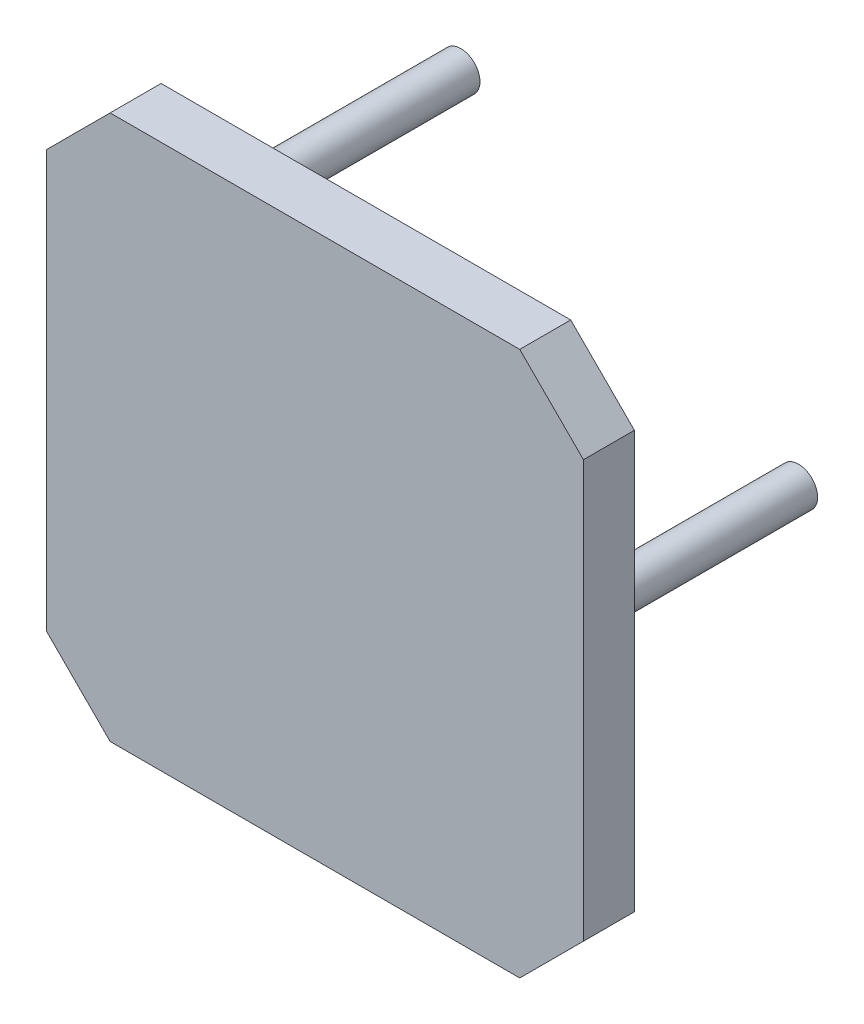
ISO-10303-21;
HEADER;
FILE_DESCRIPTION(('STEP AP214'),'2;1');
FILE_NAME('part.step','',(''),(''),'','','');
FILE_SCHEMA(('AUTOMOTIVE_DESIGN { 1 0 10303 214 1 1 1 1 }'));
ENDSEC;
DATA;
#1=APPLICATION_CONTEXT('core data for automotive mechanical design processes');
#2=APPLICATION_PROTOCOL_DEFINITION('international standard','automotive_design',2000,#1);
#3=PRODUCT_CONTEXT('',#1,'mechanical');
#4=PRODUCT('Part','Part','',(#3));
#5=PRODUCT_RELATED_PRODUCT_CATEGORY('part','',(#4));
#6=PRODUCT_DEFINITION_FORMATION('','',#4);
#7=PRODUCT_DEFINITION_CONTEXT('part definition',#1,'design');
#8=PRODUCT_DEFINITION('design','',#6,#7);
#9=PRODUCT_DEFINITION_SHAPE('','',#8);
#10=(LENGTH_UNIT() NAMED_UNIT(*) SI_UNIT(.MILLI.,.METRE.));
#11=(NAMED_UNIT(*) PLANE_ANGLE_UNIT() SI_UNIT($,.RADIAN.));
#12=(NAMED_UNIT(*) SI_UNIT($,.STERADIAN.) SOLID_ANGLE_UNIT());
#13=UNCERTAINTY_MEASURE_WITH_UNIT(LENGTH_MEASURE(1.E-05),#10,'distance_accuracy_value','');
#14=(GEOMETRIC_REPRESENTATION_CONTEXT(3) GLOBAL_UNCERTAINTY_ASSIGNED_CONTEXT((#13)) GLOBAL_UNIT_ASSIGNED_CONTEXT((#10,
#11,#12)) REPRESENTATION_CONTEXT('',''));
#15=CARTESIAN_POINT('',(0.,0.,0.));
#16=DIRECTION('',(0.,0.,1.));
#17=DIRECTION('',(1.,0.,0.));
#18=AXIS2_PLACEMENT_3D('',#15,#16,#17);
#19=CARTESIAN_POINT('',(-16.0306704898778,-21.3657958464577,4.));
#20=DIRECTION('',(0.,1.,0.));
#21=DIRECTION('',(0.,0.,1.));
#22=AXIS2_PLACEMENT_3D('',#19,#20,#21);
#23=PLANE('',#22);
#24=DIRECTION('',(1.,0.,0.));
#25=VECTOR('',#24,1.);
#26=CARTESIAN_POINT('',(-16.0306704898778,-21.3657958464577,4.));
#27=LINE('',#26,#25);
#28=CARTESIAN_POINT('',(-11.0306704898778,-21.3657958464577,4.));
#29=VERTEX_POINT('',#28);
#30=CARTESIAN_POINT('',(21.1208261403336,-21.3657958464577,4.));
#31=VERTEX_POINT('',#30);
#32=EDGE_CURVE('E124',#29,#31,#27,.T.);
#33=ORIENTED_EDGE('',*,*,#32,.F.);
#34=DIRECTION('',(0.,0.,-1.));
#35=VECTOR('',#34,1.);
#36=CARTESIAN_POINT('',(-11.0306704898778,-21.3657958464577,4.));
#37=LINE('',#36,#35);
#38=CARTESIAN_POINT('',(-11.0306704898778,-21.3657958464577,0.));
#39=VERTEX_POINT('',#38);
#40=EDGE_CURVE('E109',#29,#39,#37,.T.);
#41=ORIENTED_EDGE('',*,*,#40,.T.);
#42=DIRECTION('',(1.,0.,0.));
#43=VECTOR('',#42,1.);
#44=CARTESIAN_POINT('',(-16.0306704898778,-21.3657958464577,0.));
#45=LINE('',#44,#43);
#46=CARTESIAN_POINT('',(21.1208261403336,-21.3657958464577,0.));
#47=VERTEX_POINT('',#46);
#48=EDGE_CURVE('E121',#39,#47,#45,.T.);
#49=ORIENTED_EDGE('',*,*,#48,.T.);
#50=DIRECTION('',(0.,0.,1.));
#51=VECTOR('',#50,1.);
#52=CARTESIAN_POINT('',(21.1208261403336,-21.3657958464577,4.));
#53=LINE('',#52,#51);
#54=EDGE_CURVE('E126',#47,#31,#53,.T.);
#55=ORIENTED_EDGE('',*,*,#54,.T.);
#56=EDGE_LOOP('',(#33,#41,#49,#55));
#57=FACE_BOUND('',#56,.T.);
#58=ADVANCED_FACE('F37',(#57),#23,.F.);
#59=CARTESIAN_POINT('',(26.1208261403336,21.3657958464577,4.));
#60=DIRECTION('',(-1.,0.,0.));
#61=DIRECTION('',(0.,0.,1.));
#62=AXIS2_PLACEMENT_3D('',#59,#60,#61);
#63=PLANE('',#62);
#64=DIRECTION('',(0.,1.,0.));
#65=VECTOR('',#64,1.);
#66=CARTESIAN_POINT('',(26.1208261403336,21.3657958464577,4.));
#67=LINE('',#66,#65);
#68=CARTESIAN_POINT('',(26.1208261403336,-16.3657958464577,4.));
#69=VERTEX_POINT('',#68);
#70=CARTESIAN_POINT('',(26.1208261403336,16.3657958464577,4.));
#71=VERTEX_POINT('',#70);
#72=EDGE_CURVE('E168',#69,#71,#67,.T.);
#73=ORIENTED_EDGE('',*,*,#72,.F.);
#74=DIRECTION('',(0.,0.,-1.));
#75=VECTOR('',#74,1.);
#76=CARTESIAN_POINT('',(26.1208261403336,-16.3657958464577,4.));
#77=LINE('',#76,#75);
#78=CARTESIAN_POINT('',(26.1208261403336,-16.3657958464577,0.));
#79=VERTEX_POINT('',#78);
#80=EDGE_CURVE('E11',#69,#79,#77,.T.);
#81=ORIENTED_EDGE('',*,*,#80,.T.);
#82=DIRECTION('',(0.,1.,0.));
#83=VECTOR('',#82,1.);
#84=CARTESIAN_POINT('',(26.1208261403336,21.3657958464577,0.));
#85=LINE('',#84,#83);
#86=CARTESIAN_POINT('',(26.1208261403336,16.3657958464577,0.));
#87=VERTEX_POINT('',#86);
#88=EDGE_CURVE('E131',#79,#87,#85,.T.);
#89=ORIENTED_EDGE('',*,*,#88,.T.);
#90=DIRECTION('',(0.,0.,1.));
#91=VECTOR('',#90,1.);
#92=CARTESIAN_POINT('',(26.1208261403336,16.3657958464577,4.));
#93=LINE('',#92,#91);
#94=EDGE_CURVE('E46',#87,#71,#93,.T.);
#95=ORIENTED_EDGE('',*,*,#94,.T.);
#96=EDGE_LOOP('',(#73,#81,#89,#95));
#97=FACE_BOUND('',#96,.T.);
#98=ADVANCED_FACE('F167',(#97),#63,.F.);
#99=CARTESIAN_POINT('',(-16.0306704898778,21.3657958464577,4.));
#100=DIRECTION('',(0.,-1.,0.));
#101=DIRECTION('',(0.,0.,-1.));
#102=AXIS2_PLACEMENT_3D('',#99,#100,#101);
#103=PLANE('',#102);
#104=DIRECTION('',(-1.,0.,0.));
#105=VECTOR('',#104,1.);
#106=CARTESIAN_POINT('',(-16.0306704898778,21.3657958464577,0.));
#107=LINE('',#106,#105);
#108=CARTESIAN_POINT('',(21.1208261403336,21.3657958464577,0.));
#109=VERTEX_POINT('',#108);
#110=CARTESIAN_POINT('',(-11.0306704898778,21.3657958464577,0.));
#111=VERTEX_POINT('',#110);
#112=EDGE_CURVE('E135',#109,#111,#107,.T.);
#113=ORIENTED_EDGE('',*,*,#112,.T.);
#114=DIRECTION('',(0.,0.,1.));
#115=VECTOR('',#114,1.);
#116=CARTESIAN_POINT('',(-11.0306704898778,21.3657958464577,4.));
#117=LINE('',#116,#115);
#118=CARTESIAN_POINT('',(-11.0306704898778,21.3657958464577,4.));
#119=VERTEX_POINT('',#118);
#120=EDGE_CURVE('E53',#111,#119,#117,.T.);
#121=ORIENTED_EDGE('',*,*,#120,.T.);
#122=DIRECTION('',(-1.,0.,0.));
#123=VECTOR('',#122,1.);
#124=CARTESIAN_POINT('',(-16.0306704898778,21.3657958464577,4.));
#125=LINE('',#124,#123);
#126=CARTESIAN_POINT('',(21.1208261403336,21.3657958464577,4.));
#127=VERTEX_POINT('',#126);
#128=EDGE_CURVE('E174',#127,#119,#125,.T.);
#129=ORIENTED_EDGE('',*,*,#128,.F.);
#130=DIRECTION('',(0.,0.,-1.));
#131=VECTOR('',#130,1.);
#132=CARTESIAN_POINT('',(21.1208261403336,21.3657958464577,4.));
#133=LINE('',#132,#131);
#134=EDGE_CURVE('E161',#127,#109,#133,.T.);
#135=ORIENTED_EDGE('',*,*,#134,.T.);
#136=EDGE_LOOP('',(#113,#121,#129,#135));
#137=FACE_BOUND('',#136,.T.);
#138=ADVANCED_FACE('F178',(#137),#103,.F.);
#139=CARTESIAN_POINT('',(-16.0306704898778,-21.3657958464577,4.));
#140=DIRECTION('',(1.,0.,0.));
#141=DIRECTION('',(0.,0.,-1.));
#142=AXIS2_PLACEMENT_3D('',#139,#140,#141);
#143=PLANE('',#142);
#144=DIRECTION('',(0.,-1.,0.));
#145=VECTOR('',#144,1.);
#146=CARTESIAN_POINT('',(-16.0306704898778,-21.3657958464577,0.));
#147=LINE('',#146,#145);
#148=CARTESIAN_POINT('',(-16.0306704898778,16.3657958464577,0.));
#149=VERTEX_POINT('',#148);
#150=CARTESIAN_POINT('',(-16.0306704898778,-16.3657958464577,0.));
#151=VERTEX_POINT('',#150);
#152=EDGE_CURVE('E145',#149,#151,#147,.T.);
#153=ORIENTED_EDGE('',*,*,#152,.T.);
#154=DIRECTION('',(0.,0.,1.));
#155=VECTOR('',#154,1.);
#156=CARTESIAN_POINT('',(-16.0306704898778,-16.3657958464577,4.));
#157=LINE('',#156,#155);
#158=CARTESIAN_POINT('',(-16.0306704898778,-16.3657958464577,4.));
#159=VERTEX_POINT('',#158);
#160=EDGE_CURVE('E110',#151,#159,#157,.T.);
#161=ORIENTED_EDGE('',*,*,#160,.T.);
#162=DIRECTION('',(0.,-1.,0.));
#163=VECTOR('',#162,1.);
#164=CARTESIAN_POINT('',(-16.0306704898778,-21.3657958464577,4.));
#165=LINE('',#164,#163);
#166=CARTESIAN_POINT('',(-16.0306704898778,16.3657958464577,4.));
#167=VERTEX_POINT('',#166);
#168=EDGE_CURVE('E141',#167,#159,#165,.T.);
#169=ORIENTED_EDGE('',*,*,#168,.F.);
#170=DIRECTION('',(0.,0.,-1.));
#171=VECTOR('',#170,1.);
#172=CARTESIAN_POINT('',(-16.0306704898778,16.3657958464577,4.));
#173=LINE('',#172,#171);
#174=EDGE_CURVE('E115',#167,#149,#173,.T.);
#175=ORIENTED_EDGE('',*,*,#174,.T.);
#176=EDGE_LOOP('',(#153,#161,#169,#175));
#177=FACE_BOUND('',#176,.T.);
#178=ADVANCED_FACE('F185',(#177),#143,.F.);
#179=CARTESIAN_POINT('',(0.,0.,4.));
#180=DIRECTION('',(0.,0.,-1.));
#181=DIRECTION('',(-1.,0.,0.));
#182=AXIS2_PLACEMENT_3D('',#179,#180,#181);
#183=PLANE('',#182);
#184=ORIENTED_EDGE('',*,*,#168,.T.);
#185=DIRECTION('',(-0.707106781186547,0.707106781186549,0.));
#186=VECTOR('',#185,1.);
#187=CARTESIAN_POINT('',(-11.0306704898778,-21.3657958464577,4.));
#188=LINE('',#187,#186);
#189=EDGE_CURVE('E159',#159,#29,#188,.F.);
#190=ORIENTED_EDGE('',*,*,#189,.T.);
#191=ORIENTED_EDGE('',*,*,#32,.T.);
#192=DIRECTION('',(-0.707106781186549,-0.707106781186547,0.));
#193=VECTOR('',#192,1.);
#194=CARTESIAN_POINT('',(26.1208261403336,-16.3657958464577,4.));
#195=LINE('',#194,#193);
#196=EDGE_CURVE('E155',#31,#69,#195,.F.);
#197=ORIENTED_EDGE('',*,*,#196,.T.);
#198=ORIENTED_EDGE('',*,*,#72,.T.);
#199=DIRECTION('',(0.707106781186547,-0.707106781186549,0.));
#200=VECTOR('',#199,1.);
#201=CARTESIAN_POINT('',(21.1208261403336,21.3657958464577,4.));
#202=LINE('',#201,#200);
#203=EDGE_CURVE('E60',#71,#127,#202,.F.);
#204=ORIENTED_EDGE('',*,*,#203,.T.);
#205=ORIENTED_EDGE('',*,*,#128,.T.);
#206=DIRECTION('',(0.707106781186549,0.707106781186547,0.));
#207=VECTOR('',#206,1.);
#208=CARTESIAN_POINT('',(-16.0306704898778,16.3657958464577,4.));
#209=LINE('',#208,#207);
#210=EDGE_CURVE('E157',#119,#167,#209,.F.);
#211=ORIENTED_EDGE('',*,*,#210,.T.);
#212=EDGE_LOOP('',(#184,#190,#191,#197,#198,#204,#205,#211));
#213=FACE_BOUND('',#212,.T.);
#214=ADVANCED_FACE('F172',(#213),#183,.F.);
#215=CARTESIAN_POINT('',(0.,0.,0.));
#216=DIRECTION('',(0.,0.,-1.));
#217=DIRECTION('',(-1.,0.,0.));
#218=AXIS2_PLACEMENT_3D('',#215,#216,#217);
#219=PLANE('',#218);
#220=CARTESIAN_POINT('',(-6.5,-15.,0.));
#221=DIRECTION('',(0.,0.,-1.));
#222=DIRECTION('',(1.,0.,0.));
#223=AXIS2_PLACEMENT_3D('',#220,#221,#222);
#224=CIRCLE('',#223,1.5);
#225=CARTESIAN_POINT('',(-5.,-15.,0.));
#226=VERTEX_POINT('',#225);
#227=EDGE_CURVE('E197',#226,#226,#224,.T.);
#228=ORIENTED_EDGE('',*,*,#227,.F.);
#229=EDGE_LOOP('',(#228));
#230=FACE_BOUND('',#229,.T.);
#231=CARTESIAN_POINT('',(-6.5,15.,0.));
#232=DIRECTION('',(0.,0.,-1.));
#233=DIRECTION('',(-1.,0.,0.));
#234=AXIS2_PLACEMENT_3D('',#231,#232,#233);
#235=CIRCLE('',#234,1.5);
#236=CARTESIAN_POINT('',(-8.,15.,0.));
#237=VERTEX_POINT('',#236);
#238=EDGE_CURVE('E191',#237,#237,#235,.T.);
#239=ORIENTED_EDGE('',*,*,#238,.F.);
#240=EDGE_LOOP('',(#239));
#241=FACE_BOUND('',#240,.T.);
#242=CARTESIAN_POINT('',(20.,0.,0.));
#243=DIRECTION('',(0.,0.,-1.));
#244=DIRECTION('',(-1.,0.,0.));
#245=AXIS2_PLACEMENT_3D('',#242,#243,#244);
#246=CIRCLE('',#245,1.5);
#247=CARTESIAN_POINT('',(18.5,0.,0.));
#248=VERTEX_POINT('',#247);
#249=EDGE_CURVE('E138',#248,#248,#246,.T.);
#250=ORIENTED_EDGE('',*,*,#249,.F.);
#251=EDGE_LOOP('',(#250));
#252=FACE_BOUND('',#251,.T.);
#253=ORIENTED_EDGE('',*,*,#48,.F.);
#254=DIRECTION('',(0.707106781186547,-0.707106781186549,0.));
#255=VECTOR('',#254,1.);
#256=CARTESIAN_POINT('',(-16.1982331681678,-16.1982331681677,0.));
#257=LINE('',#256,#255);
#258=EDGE_CURVE('E105',#39,#151,#257,.F.);
#259=ORIENTED_EDGE('',*,*,#258,.T.);
#260=ORIENTED_EDGE('',*,*,#152,.F.);
#261=DIRECTION('',(-0.707106781186549,-0.707106781186547,0.));
#262=VECTOR('',#261,1.);
#263=CARTESIAN_POINT('',(-16.1982331681677,16.1982331681678,0.));
#264=LINE('',#263,#262);
#265=EDGE_CURVE('E116',#149,#111,#264,.F.);
#266=ORIENTED_EDGE('',*,*,#265,.T.);
#267=ORIENTED_EDGE('',*,*,#112,.F.);
#268=DIRECTION('',(-0.707106781186547,0.707106781186549,0.));
#269=VECTOR('',#268,1.);
#270=CARTESIAN_POINT('',(21.2433109933957,21.2433109933956,0.));
#271=LINE('',#270,#269);
#272=EDGE_CURVE('E125',#109,#87,#271,.F.);
#273=ORIENTED_EDGE('',*,*,#272,.T.);
#274=ORIENTED_EDGE('',*,*,#88,.F.);
#275=DIRECTION('',(0.707106781186549,0.707106781186547,0.));
#276=VECTOR('',#275,1.);
#277=CARTESIAN_POINT('',(21.2433109933956,-21.2433109933957,0.));
#278=LINE('',#277,#276);
#279=EDGE_CURVE('E130',#79,#47,#278,.F.);
#280=ORIENTED_EDGE('',*,*,#279,.T.);
#281=EDGE_LOOP('',(#253,#259,#260,#266,#267,#273,#274,#280));
#282=FACE_BOUND('',#281,.T.);
#283=ADVANCED_FACE('F128',(#230,#241,#252,#282),#219,.T.);
#284=CARTESIAN_POINT('',(-11.0306704898778,-21.3657958464577,4.));
#285=DIRECTION('',(0.707106781186548,0.707106781186546,0.));
#286=DIRECTION('',(0.,0.,-1.));
#287=AXIS2_PLACEMENT_3D('',#284,#285,#286);
#288=PLANE('',#287);
#289=ORIENTED_EDGE('',*,*,#189,.F.);
#290=ORIENTED_EDGE('',*,*,#160,.F.);
#291=ORIENTED_EDGE('',*,*,#258,.F.);
#292=ORIENTED_EDGE('',*,*,#40,.F.);
#293=EDGE_LOOP('',(#289,#290,#291,#292));
#294=FACE_BOUND('',#293,.T.);
#295=ADVANCED_FACE('F108',(#294),#288,.F.);
#296=CARTESIAN_POINT('',(-16.0306704898778,16.3657958464577,4.));
#297=DIRECTION('',(0.707106781186546,-0.707106781186548,0.));
#298=DIRECTION('',(0.,0.,-1.));
#299=AXIS2_PLACEMENT_3D('',#296,#297,#298);
#300=PLANE('',#299);
#301=ORIENTED_EDGE('',*,*,#210,.F.);
#302=ORIENTED_EDGE('',*,*,#120,.F.);
#303=ORIENTED_EDGE('',*,*,#265,.F.);
#304=ORIENTED_EDGE('',*,*,#174,.F.);
#305=EDGE_LOOP('',(#301,#302,#303,#304));
#306=FACE_BOUND('',#305,.T.);
#307=ADVANCED_FACE('F182',(#306),#300,.F.);
#308=CARTESIAN_POINT('',(26.1208261403336,-16.3657958464577,4.));
#309=DIRECTION('',(-0.707106781186546,0.707106781186548,0.));
#310=DIRECTION('',(0.,0.,-1.));
#311=AXIS2_PLACEMENT_3D('',#308,#309,#310);
#312=PLANE('',#311);
#313=ORIENTED_EDGE('',*,*,#196,.F.);
#314=ORIENTED_EDGE('',*,*,#54,.F.);
#315=ORIENTED_EDGE('',*,*,#279,.F.);
#316=ORIENTED_EDGE('',*,*,#80,.F.);
#317=EDGE_LOOP('',(#313,#314,#315,#316));
#318=FACE_BOUND('',#317,.T.);
#319=ADVANCED_FACE('F231',(#318),#312,.F.);
#320=CARTESIAN_POINT('',(21.1208261403336,21.3657958464577,4.));
#321=DIRECTION('',(-0.707106781186549,-0.707106781186547,0.));
#322=DIRECTION('',(0.,0.,-1.));
#323=AXIS2_PLACEMENT_3D('',#320,#321,#322);
#324=PLANE('',#323);
#325=ORIENTED_EDGE('',*,*,#203,.F.);
#326=ORIENTED_EDGE('',*,*,#94,.F.);
#327=ORIENTED_EDGE('',*,*,#272,.F.);
#328=ORIENTED_EDGE('',*,*,#134,.F.);
#329=EDGE_LOOP('',(#325,#326,#327,#328));
#330=FACE_BOUND('',#329,.T.);
#331=ADVANCED_FACE('F40',(#330),#324,.F.);
#332=CARTESIAN_POINT('',(20.,0.,-19.));
#333=DIRECTION('',(0.,0.,1.));
#334=DIRECTION('',(1.,0.,0.));
#335=AXIS2_PLACEMENT_3D('',#332,#333,#334);
#336=CYLINDRICAL_SURFACE('',#335,1.5);
#337=CARTESIAN_POINT('',(20.,0.,-19.));
#338=DIRECTION('',(0.,0.,-1.));
#339=DIRECTION('',(-1.,0.,0.));
#340=AXIS2_PLACEMENT_3D('',#337,#338,#339);
#341=CIRCLE('',#340,1.5);
#342=CARTESIAN_POINT('',(18.5,0.,-19.));
#343=VERTEX_POINT('',#342);
#344=EDGE_CURVE('E132',#343,#343,#341,.T.);
#345=ORIENTED_EDGE('',*,*,#344,.F.);
#346=EDGE_LOOP('',(#345));
#347=FACE_BOUND('',#346,.T.);
#348=ORIENTED_EDGE('',*,*,#249,.T.);
#349=EDGE_LOOP('',(#348));
#350=FACE_BOUND('',#349,.T.);
#351=ADVANCED_FACE('F219',(#347,#350),#336,.T.);
#352=CARTESIAN_POINT('',(20.,0.,-19.));
#353=DIRECTION('',(0.,0.,-1.));
#354=DIRECTION('',(-1.,0.,0.));
#355=AXIS2_PLACEMENT_3D('',#352,#353,#354);
#356=PLANE('',#355);
#357=ORIENTED_EDGE('',*,*,#344,.T.);
#358=EDGE_LOOP('',(#357));
#359=FACE_BOUND('',#358,.T.);
#360=ADVANCED_FACE('F221',(#359),#356,.T.);
#361=CARTESIAN_POINT('',(-6.5,15.,-19.));
#362=DIRECTION('',(0.,0.,1.));
#363=DIRECTION('',(1.,0.,0.));
#364=AXIS2_PLACEMENT_3D('',#361,#362,#363);
#365=CYLINDRICAL_SURFACE('',#364,1.5);
#366=CARTESIAN_POINT('',(-6.5,15.,-19.));
#367=DIRECTION('',(0.,0.,-1.));
#368=DIRECTION('',(-1.,0.,0.));
#369=AXIS2_PLACEMENT_3D('',#366,#367,#368);
#370=CIRCLE('',#369,1.5);
#371=CARTESIAN_POINT('',(-8.,15.,-19.));
#372=VERTEX_POINT('',#371);
#373=EDGE_CURVE('E189',#372,#372,#370,.T.);
#374=ORIENTED_EDGE('',*,*,#373,.F.);
#375=EDGE_LOOP('',(#374));
#376=FACE_BOUND('',#375,.T.);
#377=ORIENTED_EDGE('',*,*,#238,.T.);
#378=EDGE_LOOP('',(#377));
#379=FACE_BOUND('',#378,.T.);
#380=ADVANCED_FACE('F228',(#376,#379),#365,.T.);
#381=CARTESIAN_POINT('',(-6.5,15.,-19.));
#382=DIRECTION('',(0.,0.,-1.));
#383=DIRECTION('',(-1.,0.,0.));
#384=AXIS2_PLACEMENT_3D('',#381,#382,#383);
#385=PLANE('',#384);
#386=ORIENTED_EDGE('',*,*,#373,.T.);
#387=EDGE_LOOP('',(#386));
#388=FACE_BOUND('',#387,.T.);
#389=ADVANCED_FACE('F208',(#388),#385,.T.);
#390=CARTESIAN_POINT('',(-6.5,-15.,-19.));
#391=DIRECTION('',(0.,0.,1.));
#392=DIRECTION('',(1.,0.,0.));
#393=AXIS2_PLACEMENT_3D('',#390,#391,#392);
#394=CYLINDRICAL_SURFACE('',#393,1.5);
#395=CARTESIAN_POINT('',(-6.5,-15.,-19.));
#396=DIRECTION('',(0.,0.,-1.));
#397=DIRECTION('',(1.,0.,0.));
#398=AXIS2_PLACEMENT_3D('',#395,#396,#397);
#399=CIRCLE('',#398,1.5);
#400=CARTESIAN_POINT('',(-5.,-15.,-19.));
#401=VERTEX_POINT('',#400);
#402=EDGE_CURVE('E194',#401,#401,#399,.T.);
#403=ORIENTED_EDGE('',*,*,#402,.F.);
#404=EDGE_LOOP('',(#403));
#405=FACE_BOUND('',#404,.T.);
#406=ORIENTED_EDGE('',*,*,#227,.T.);
#407=EDGE_LOOP('',(#406));
#408=FACE_BOUND('',#407,.T.);
#409=ADVANCED_FACE('F205',(#405,#408),#394,.T.);
#410=CARTESIAN_POINT('',(-6.5,-15.,-19.));
#411=DIRECTION('',(0.,0.,1.));
#412=DIRECTION('',(1.,0.,0.));
#413=AXIS2_PLACEMENT_3D('',#410,#411,#412);
#414=PLANE('',#413);
#415=ORIENTED_EDGE('',*,*,#402,.T.);
#416=EDGE_LOOP('',(#415));
#417=FACE_BOUND('',#416,.T.);
#418=ADVANCED_FACE('F203',(#417),#414,.F.);
#419=CLOSED_SHELL('',(#58,#98,#138,#178,#214,#283,#295,#307,#319,#331,#351,#360,#380,#389,#409,#418));
#420=MANIFOLD_SOLID_BREP('B2',#419);
#421=ADVANCED_BREP_SHAPE_REPRESENTATION('',(#18,#420),#14);
#422=SHAPE_DEFINITION_REPRESENTATION(#9,#421);
ENDSEC;
END-ISO-10303-21;
